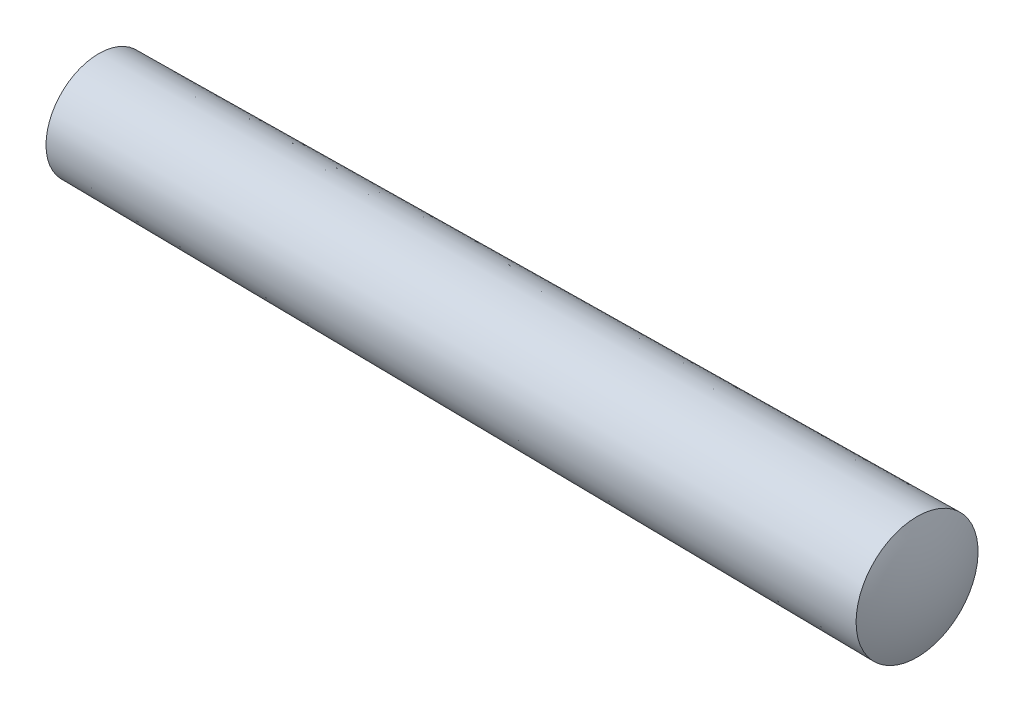
ISO-10303-21;
HEADER;
FILE_DESCRIPTION(('STEP AP214'),'2;1');
FILE_NAME('part.step','',(''),(''),'','','');
FILE_SCHEMA(('AUTOMOTIVE_DESIGN { 1 0 10303 214 1 1 1 1 }'));
ENDSEC;
DATA;
#1=APPLICATION_CONTEXT('core data for automotive mechanical design processes');
#2=APPLICATION_PROTOCOL_DEFINITION('international standard','automotive_design',2000,#1);
#3=PRODUCT_CONTEXT('',#1,'mechanical');
#4=PRODUCT('Part','Part','',(#3));
#5=PRODUCT_RELATED_PRODUCT_CATEGORY('part','',(#4));
#6=PRODUCT_DEFINITION_FORMATION('','',#4);
#7=PRODUCT_DEFINITION_CONTEXT('part definition',#1,'design');
#8=PRODUCT_DEFINITION('design','',#6,#7);
#9=PRODUCT_DEFINITION_SHAPE('','',#8);
#10=(LENGTH_UNIT() NAMED_UNIT(*) SI_UNIT(.MILLI.,.METRE.));
#11=(NAMED_UNIT(*) PLANE_ANGLE_UNIT() SI_UNIT($,.RADIAN.));
#12=(NAMED_UNIT(*) SI_UNIT($,.STERADIAN.) SOLID_ANGLE_UNIT());
#13=UNCERTAINTY_MEASURE_WITH_UNIT(LENGTH_MEASURE(1.E-05),#10,'distance_accuracy_value','');
#14=(GEOMETRIC_REPRESENTATION_CONTEXT(3) GLOBAL_UNCERTAINTY_ASSIGNED_CONTEXT((#13)) GLOBAL_UNIT_ASSIGNED_CONTEXT((#10,
#11,#12)) REPRESENTATION_CONTEXT('',''));
#15=CARTESIAN_POINT('',(0.,0.,0.));
#16=DIRECTION('',(0.,0.,1.));
#17=DIRECTION('',(1.,0.,0.));
#18=AXIS2_PLACEMENT_3D('',#15,#16,#17);
#19=CARTESIAN_POINT('',(33.068270827515,0.,0.));
#20=DIRECTION('',(-1.,0.,0.));
#21=DIRECTION('',(0.,1.,0.));
#22=AXIS2_PLACEMENT_3D('',#19,#20,#21);
#23=SPHERICAL_SURFACE('',#22,6.93172917248503);
#24=CARTESIAN_POINT('',(39.37,0.,0.));
#25=DIRECTION('',(-1.,0.,0.));
#26=DIRECTION('',(0.,0.,1.));
#27=AXIS2_PLACEMENT_3D('',#24,#25,#26);
#28=CIRCLE('',#27,2.88739999953784);
#29=CARTESIAN_POINT('',(39.37,0.,2.88739999953784));
#30=VERTEX_POINT('',#29);
#31=EDGE_CURVE('E36',#30,#30,#28,.T.);
#32=ORIENTED_EDGE('',*,*,#31,.F.);
#33=EDGE_LOOP('',(#32));
#34=FACE_BOUND('',#33,.T.);
#35=ADVANCED_FACE('F30',(#34),#23,.T.);
#36=CARTESIAN_POINT('',(5.27531746031746,0.,0.));
#37=DIRECTION('',(-1.,0.,0.));
#38=DIRECTION('',(0.,1.,0.));
#39=AXIS2_PLACEMENT_3D('',#36,#37,#38);
#40=SPHERICAL_SURFACE('',#39,5.27531746031746);
#41=CARTESIAN_POINT('',(0.63,0.,0.));
#42=DIRECTION('',(-1.,0.,0.));
#43=DIRECTION('',(0.,0.,1.));
#44=AXIS2_PLACEMENT_3D('',#41,#42,#43);
#45=CIRCLE('',#44,2.5);
#46=CARTESIAN_POINT('',(0.63,0.,2.5));
#47=VERTEX_POINT('',#46);
#48=EDGE_CURVE('E10',#47,#47,#45,.T.);
#49=ORIENTED_EDGE('',*,*,#48,.T.);
#50=EDGE_LOOP('',(#49));
#51=FACE_BOUND('',#50,.T.);
#52=ADVANCED_FACE('F45',(#51),#40,.T.);
#53=CARTESIAN_POINT('',(39.37,0.,0.));
#54=DIRECTION('',(1.,0.,0.));
#55=DIRECTION('',(0.,0.,-1.));
#56=AXIS2_PLACEMENT_3D('',#53,#54,#55);
#57=CONICAL_SURFACE('',#56,2.88739999953784,0.00999966667473662);
#58=ORIENTED_EDGE('',*,*,#48,.F.);
#59=EDGE_LOOP('',(#58));
#60=FACE_BOUND('',#59,.T.);
#61=ORIENTED_EDGE('',*,*,#31,.T.);
#62=EDGE_LOOP('',(#61));
#63=FACE_BOUND('',#62,.T.);
#64=ADVANCED_FACE('F42',(#60,#63),#57,.T.);
#65=CLOSED_SHELL('',(#35,#52,#64));
#66=MANIFOLD_SOLID_BREP('B2',#65);
#67=ADVANCED_BREP_SHAPE_REPRESENTATION('',(#18,#66),#14);
#68=SHAPE_DEFINITION_REPRESENTATION(#9,#67);
ENDSEC;
END-ISO-10303-21;
